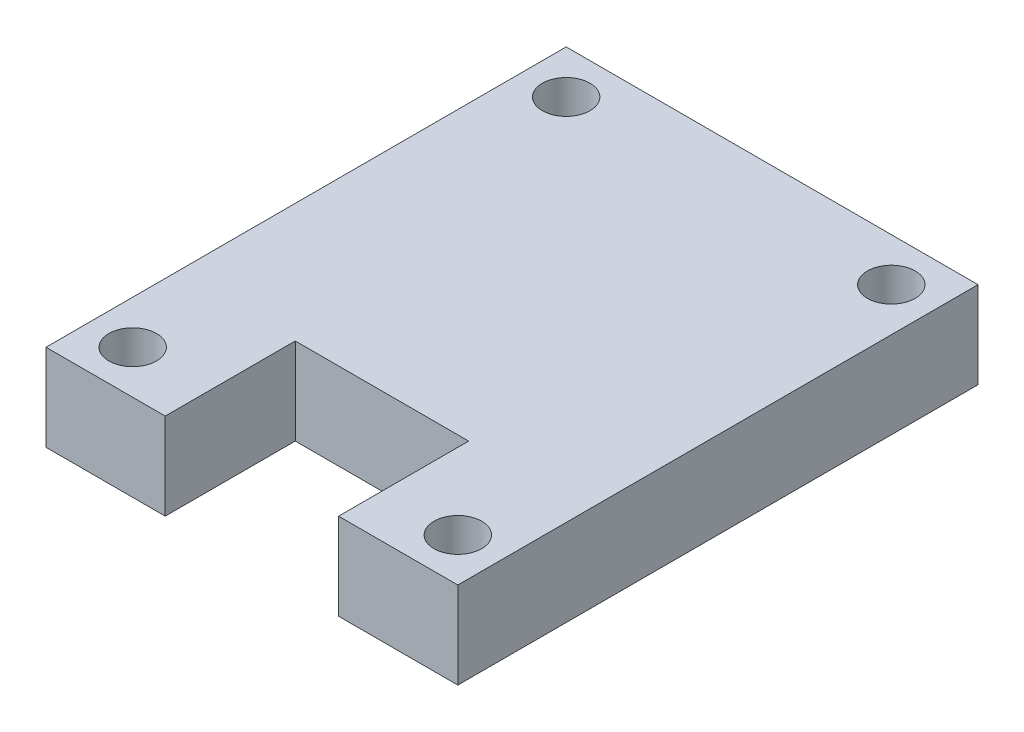
ISO-10303-21;
HEADER;
FILE_DESCRIPTION(('STEP AP214'),'2;1');
FILE_NAME('part.step','',(''),(''),'','','');
FILE_SCHEMA(('AUTOMOTIVE_DESIGN { 1 0 10303 214 1 1 1 1 }'));
ENDSEC;
DATA;
#1=APPLICATION_CONTEXT('core data for automotive mechanical design processes');
#2=APPLICATION_PROTOCOL_DEFINITION('international standard','automotive_design',2000,#1);
#3=PRODUCT_CONTEXT('',#1,'mechanical');
#4=PRODUCT('Part','Part','',(#3));
#5=PRODUCT_RELATED_PRODUCT_CATEGORY('part','',(#4));
#6=PRODUCT_DEFINITION_FORMATION('','',#4);
#7=PRODUCT_DEFINITION_CONTEXT('part definition',#1,'design');
#8=PRODUCT_DEFINITION('design','',#6,#7);
#9=PRODUCT_DEFINITION_SHAPE('','',#8);
#10=(LENGTH_UNIT() NAMED_UNIT(*) SI_UNIT(.MILLI.,.METRE.));
#11=(NAMED_UNIT(*) PLANE_ANGLE_UNIT() SI_UNIT($,.RADIAN.));
#12=(NAMED_UNIT(*) SI_UNIT($,.STERADIAN.) SOLID_ANGLE_UNIT());
#13=UNCERTAINTY_MEASURE_WITH_UNIT(LENGTH_MEASURE(1.E-05),#10,'distance_accuracy_value','');
#14=(GEOMETRIC_REPRESENTATION_CONTEXT(3) GLOBAL_UNCERTAINTY_ASSIGNED_CONTEXT((#13)) GLOBAL_UNIT_ASSIGNED_CONTEXT((#10,
#11,#12)) REPRESENTATION_CONTEXT('',''));
#15=CARTESIAN_POINT('',(0.,0.,0.));
#16=DIRECTION('',(0.,0.,1.));
#17=DIRECTION('',(1.,0.,0.));
#18=AXIS2_PLACEMENT_3D('',#15,#16,#17);
#19=CARTESIAN_POINT('',(0.,8.,0.));
#20=DIRECTION('',(0.,0.,-1.));
#21=DIRECTION('',(-1.,0.,0.));
#22=AXIS2_PLACEMENT_3D('',#19,#20,#21);
#23=PLANE('',#22);
#24=DIRECTION('',(1.,0.,0.));
#25=VECTOR('',#24,1.);
#26=CARTESIAN_POINT('',(0.,0.,0.));
#27=LINE('',#26,#25);
#28=CARTESIAN_POINT('',(0.,0.,0.));
#29=VERTEX_POINT('',#28);
#30=CARTESIAN_POINT('',(11.,0.,0.));
#31=VERTEX_POINT('',#30);
#32=EDGE_CURVE('E134',#29,#31,#27,.T.);
#33=ORIENTED_EDGE('',*,*,#32,.T.);
#34=DIRECTION('',(0.,1.,0.));
#35=VECTOR('',#34,1.);
#36=CARTESIAN_POINT('',(11.,0.,0.));
#37=LINE('',#36,#35);
#38=CARTESIAN_POINT('',(11.,8.,0.));
#39=VERTEX_POINT('',#38);
#40=EDGE_CURVE('E168',#31,#39,#37,.T.);
#41=ORIENTED_EDGE('',*,*,#40,.T.);
#42=DIRECTION('',(1.,0.,0.));
#43=VECTOR('',#42,1.);
#44=CARTESIAN_POINT('',(0.,8.,0.));
#45=LINE('',#44,#43);
#46=CARTESIAN_POINT('',(0.,8.,0.));
#47=VERTEX_POINT('',#46);
#48=EDGE_CURVE('E89',#47,#39,#45,.T.);
#49=ORIENTED_EDGE('',*,*,#48,.F.);
#50=DIRECTION('',(0.,-1.,0.));
#51=VECTOR('',#50,1.);
#52=CARTESIAN_POINT('',(0.,8.,0.));
#53=LINE('',#52,#51);
#54=EDGE_CURVE('E11',#47,#29,#53,.T.);
#55=ORIENTED_EDGE('',*,*,#54,.T.);
#56=EDGE_LOOP('',(#33,#41,#49,#55));
#57=FACE_BOUND('',#56,.T.);
#58=ADVANCED_FACE('F37',(#57),#23,.F.);
#59=CARTESIAN_POINT('',(0.,8.,-48.));
#60=DIRECTION('',(1.,0.,0.));
#61=DIRECTION('',(0.,0.,-1.));
#62=AXIS2_PLACEMENT_3D('',#59,#60,#61);
#63=PLANE('',#62);
#64=DIRECTION('',(0.,0.,1.));
#65=VECTOR('',#64,1.);
#66=CARTESIAN_POINT('',(0.,0.,-48.));
#67=LINE('',#66,#65);
#68=CARTESIAN_POINT('',(0.,0.,-48.));
#69=VERTEX_POINT('',#68);
#70=EDGE_CURVE('E135',#69,#29,#67,.T.);
#71=ORIENTED_EDGE('',*,*,#70,.T.);
#72=ORIENTED_EDGE('',*,*,#54,.F.);
#73=DIRECTION('',(0.,0.,1.));
#74=VECTOR('',#73,1.);
#75=CARTESIAN_POINT('',(0.,8.,-48.));
#76=LINE('',#75,#74);
#77=CARTESIAN_POINT('',(0.,8.,-48.));
#78=VERTEX_POINT('',#77);
#79=EDGE_CURVE('E145',#78,#47,#76,.T.);
#80=ORIENTED_EDGE('',*,*,#79,.F.);
#81=DIRECTION('',(0.,-1.,0.));
#82=VECTOR('',#81,1.);
#83=CARTESIAN_POINT('',(0.,8.,-48.));
#84=LINE('',#83,#82);
#85=EDGE_CURVE('E146',#78,#69,#84,.T.);
#86=ORIENTED_EDGE('',*,*,#85,.T.);
#87=EDGE_LOOP('',(#71,#72,#80,#86));
#88=FACE_BOUND('',#87,.T.);
#89=ADVANCED_FACE('F39',(#88),#63,.F.);
#90=CARTESIAN_POINT('',(27.,8.,0.));
#91=VERTEX_POINT('',#90);
#92=CARTESIAN_POINT('',(38.,8.,0.));
#93=VERTEX_POINT('',#92);
#94=EDGE_CURVE('E128',#91,#93,#45,.T.);
#95=ORIENTED_EDGE('',*,*,#94,.F.);
#96=DIRECTION('',(0.,1.,0.));
#97=VECTOR('',#96,1.);
#98=CARTESIAN_POINT('',(27.,0.,0.));
#99=LINE('',#98,#97);
#100=CARTESIAN_POINT('',(27.,0.,0.));
#101=VERTEX_POINT('',#100);
#102=EDGE_CURVE('E115',#101,#91,#99,.T.);
#103=ORIENTED_EDGE('',*,*,#102,.F.);
#104=CARTESIAN_POINT('',(38.,0.,0.));
#105=VERTEX_POINT('',#104);
#106=EDGE_CURVE('E126',#101,#105,#27,.T.);
#107=ORIENTED_EDGE('',*,*,#106,.T.);
#108=DIRECTION('',(0.,-1.,0.));
#109=VECTOR('',#108,1.);
#110=CARTESIAN_POINT('',(38.,8.,0.));
#111=LINE('',#110,#109);
#112=EDGE_CURVE('E45',#93,#105,#111,.T.);
#113=ORIENTED_EDGE('',*,*,#112,.F.);
#114=EDGE_LOOP('',(#95,#103,#107,#113));
#115=FACE_BOUND('',#114,.T.);
#116=ADVANCED_FACE('F124',(#115),#23,.F.);
#117=CARTESIAN_POINT('',(38.,8.,0.));
#118=DIRECTION('',(-1.,0.,0.));
#119=DIRECTION('',(0.,0.,1.));
#120=AXIS2_PLACEMENT_3D('',#117,#118,#119);
#121=PLANE('',#120);
#122=DIRECTION('',(0.,0.,-1.));
#123=VECTOR('',#122,1.);
#124=CARTESIAN_POINT('',(38.,0.,0.));
#125=LINE('',#124,#123);
#126=CARTESIAN_POINT('',(38.,0.,-48.));
#127=VERTEX_POINT('',#126);
#128=EDGE_CURVE('E133',#105,#127,#125,.T.);
#129=ORIENTED_EDGE('',*,*,#128,.T.);
#130=DIRECTION('',(0.,-1.,0.));
#131=VECTOR('',#130,1.);
#132=CARTESIAN_POINT('',(38.,8.,-48.));
#133=LINE('',#132,#131);
#134=CARTESIAN_POINT('',(38.,8.,-48.));
#135=VERTEX_POINT('',#134);
#136=EDGE_CURVE('E148',#135,#127,#133,.T.);
#137=ORIENTED_EDGE('',*,*,#136,.F.);
#138=DIRECTION('',(0.,0.,-1.));
#139=VECTOR('',#138,1.);
#140=CARTESIAN_POINT('',(38.,8.,0.));
#141=LINE('',#140,#139);
#142=EDGE_CURVE('E153',#93,#135,#141,.T.);
#143=ORIENTED_EDGE('',*,*,#142,.F.);
#144=ORIENTED_EDGE('',*,*,#112,.T.);
#145=EDGE_LOOP('',(#129,#137,#143,#144));
#146=FACE_BOUND('',#145,.T.);
#147=ADVANCED_FACE('F151',(#146),#121,.F.);
#148=CARTESIAN_POINT('',(38.,8.,-48.));
#149=DIRECTION('',(0.,0.,1.));
#150=DIRECTION('',(1.,0.,0.));
#151=AXIS2_PLACEMENT_3D('',#148,#149,#150);
#152=PLANE('',#151);
#153=DIRECTION('',(-1.,0.,0.));
#154=VECTOR('',#153,1.);
#155=CARTESIAN_POINT('',(38.,0.,-48.));
#156=LINE('',#155,#154);
#157=EDGE_CURVE('E82',#127,#69,#156,.T.);
#158=ORIENTED_EDGE('',*,*,#157,.T.);
#159=ORIENTED_EDGE('',*,*,#85,.F.);
#160=DIRECTION('',(-1.,0.,0.));
#161=VECTOR('',#160,1.);
#162=CARTESIAN_POINT('',(38.,8.,-48.));
#163=LINE('',#162,#161);
#164=EDGE_CURVE('E61',#135,#78,#163,.T.);
#165=ORIENTED_EDGE('',*,*,#164,.F.);
#166=ORIENTED_EDGE('',*,*,#136,.T.);
#167=EDGE_LOOP('',(#158,#159,#165,#166));
#168=FACE_BOUND('',#167,.T.);
#169=ADVANCED_FACE('F200',(#168),#152,.F.);
#170=CARTESIAN_POINT('',(0.,8.,0.));
#171=DIRECTION('',(0.,1.,0.));
#172=DIRECTION('',(0.,0.,1.));
#173=AXIS2_PLACEMENT_3D('',#170,#171,#172);
#174=PLANE('',#173);
#175=DIRECTION('',(0.,0.,1.));
#176=VECTOR('',#175,1.);
#177=CARTESIAN_POINT('',(11.,8.,0.));
#178=LINE('',#177,#176);
#179=CARTESIAN_POINT('',(11.,8.,-12.));
#180=VERTEX_POINT('',#179);
#181=EDGE_CURVE('E120',#180,#39,#178,.T.);
#182=ORIENTED_EDGE('',*,*,#181,.F.);
#183=DIRECTION('',(-1.,0.,0.));
#184=VECTOR('',#183,1.);
#185=CARTESIAN_POINT('',(11.,8.,-12.));
#186=LINE('',#185,#184);
#187=CARTESIAN_POINT('',(27.,8.,-12.));
#188=VERTEX_POINT('',#187);
#189=EDGE_CURVE('E187',#188,#180,#186,.T.);
#190=ORIENTED_EDGE('',*,*,#189,.F.);
#191=DIRECTION('',(0.,0.,-1.));
#192=VECTOR('',#191,1.);
#193=CARTESIAN_POINT('',(27.,8.,-12.));
#194=LINE('',#193,#192);
#195=EDGE_CURVE('E190',#91,#188,#194,.T.);
#196=ORIENTED_EDGE('',*,*,#195,.F.);
#197=ORIENTED_EDGE('',*,*,#94,.T.);
#198=ORIENTED_EDGE('',*,*,#142,.T.);
#199=ORIENTED_EDGE('',*,*,#164,.T.);
#200=ORIENTED_EDGE('',*,*,#79,.T.);
#201=ORIENTED_EDGE('',*,*,#48,.T.);
#202=EDGE_LOOP('',(#182,#190,#196,#197,#198,#199,#200,#201));
#203=FACE_BOUND('',#202,.T.);
#204=CARTESIAN_POINT('',(4.,8.,-44.));
#205=DIRECTION('',(0.,-1.,0.));
#206=DIRECTION('',(0.,0.,-1.));
#207=AXIS2_PLACEMENT_3D('',#204,#205,#206);
#208=CIRCLE('',#207,2.2);
#209=CARTESIAN_POINT('',(4.,8.,-46.2));
#210=VERTEX_POINT('',#209);
#211=EDGE_CURVE('E167',#210,#210,#208,.T.);
#212=ORIENTED_EDGE('',*,*,#211,.T.);
#213=EDGE_LOOP('',(#212));
#214=FACE_BOUND('',#213,.T.);
#215=CARTESIAN_POINT('',(34.,8.,-44.));
#216=DIRECTION('',(0.,-1.,0.));
#217=DIRECTION('',(0.,0.,-1.));
#218=AXIS2_PLACEMENT_3D('',#215,#216,#217);
#219=CIRCLE('',#218,2.2);
#220=CARTESIAN_POINT('',(34.,8.,-46.2));
#221=VERTEX_POINT('',#220);
#222=EDGE_CURVE('E174',#221,#221,#219,.T.);
#223=ORIENTED_EDGE('',*,*,#222,.T.);
#224=EDGE_LOOP('',(#223));
#225=FACE_BOUND('',#224,.T.);
#226=CARTESIAN_POINT('',(34.,8.,-4.));
#227=DIRECTION('',(0.,-1.,0.));
#228=DIRECTION('',(0.,0.,-1.));
#229=AXIS2_PLACEMENT_3D('',#226,#227,#228);
#230=CIRCLE('',#229,2.2);
#231=CARTESIAN_POINT('',(34.,8.,-6.2));
#232=VERTEX_POINT('',#231);
#233=EDGE_CURVE('E161',#232,#232,#230,.T.);
#234=ORIENTED_EDGE('',*,*,#233,.T.);
#235=EDGE_LOOP('',(#234));
#236=FACE_BOUND('',#235,.T.);
#237=CARTESIAN_POINT('',(4.,8.,-4.));
#238=DIRECTION('',(0.,-1.,0.));
#239=DIRECTION('',(0.,0.,-1.));
#240=AXIS2_PLACEMENT_3D('',#237,#238,#239);
#241=CIRCLE('',#240,2.2);
#242=CARTESIAN_POINT('',(4.,8.,-6.2));
#243=VERTEX_POINT('',#242);
#244=EDGE_CURVE('E139',#243,#243,#241,.T.);
#245=ORIENTED_EDGE('',*,*,#244,.T.);
#246=EDGE_LOOP('',(#245));
#247=FACE_BOUND('',#246,.T.);
#248=ADVANCED_FACE('F202',(#203,#214,#225,#236,#247),#174,.T.);
#249=CARTESIAN_POINT('',(0.,0.,0.));
#250=DIRECTION('',(0.,1.,0.));
#251=DIRECTION('',(0.,0.,1.));
#252=AXIS2_PLACEMENT_3D('',#249,#250,#251);
#253=PLANE('',#252);
#254=CARTESIAN_POINT('',(4.,0.,-44.));
#255=DIRECTION('',(0.,-1.,0.));
#256=DIRECTION('',(0.,0.,-1.));
#257=AXIS2_PLACEMENT_3D('',#254,#255,#256);
#258=CIRCLE('',#257,2.2);
#259=CARTESIAN_POINT('',(4.,0.,-46.2));
#260=VERTEX_POINT('',#259);
#261=EDGE_CURVE('E164',#260,#260,#258,.T.);
#262=ORIENTED_EDGE('',*,*,#261,.F.);
#263=EDGE_LOOP('',(#262));
#264=FACE_BOUND('',#263,.T.);
#265=CARTESIAN_POINT('',(34.,0.,-44.));
#266=DIRECTION('',(0.,-1.,0.));
#267=DIRECTION('',(0.,0.,-1.));
#268=AXIS2_PLACEMENT_3D('',#265,#266,#267);
#269=CIRCLE('',#268,2.2);
#270=CARTESIAN_POINT('',(34.,0.,-46.2));
#271=VERTEX_POINT('',#270);
#272=EDGE_CURVE('E171',#271,#271,#269,.T.);
#273=ORIENTED_EDGE('',*,*,#272,.F.);
#274=EDGE_LOOP('',(#273));
#275=FACE_BOUND('',#274,.T.);
#276=CARTESIAN_POINT('',(34.,0.,-4.));
#277=DIRECTION('',(0.,-1.,0.));
#278=DIRECTION('',(0.,0.,-1.));
#279=AXIS2_PLACEMENT_3D('',#276,#277,#278);
#280=CIRCLE('',#279,2.2);
#281=CARTESIAN_POINT('',(34.,0.,-6.2));
#282=VERTEX_POINT('',#281);
#283=EDGE_CURVE('E177',#282,#282,#280,.T.);
#284=ORIENTED_EDGE('',*,*,#283,.F.);
#285=EDGE_LOOP('',(#284));
#286=FACE_BOUND('',#285,.T.);
#287=CARTESIAN_POINT('',(4.,0.,-4.));
#288=DIRECTION('',(0.,-1.,0.));
#289=DIRECTION('',(0.,0.,-1.));
#290=AXIS2_PLACEMENT_3D('',#287,#288,#289);
#291=CIRCLE('',#290,2.2);
#292=CARTESIAN_POINT('',(4.,0.,-6.2));
#293=VERTEX_POINT('',#292);
#294=EDGE_CURVE('E158',#293,#293,#291,.T.);
#295=ORIENTED_EDGE('',*,*,#294,.F.);
#296=EDGE_LOOP('',(#295));
#297=FACE_BOUND('',#296,.T.);
#298=DIRECTION('',(-1.,0.,0.));
#299=VECTOR('',#298,1.);
#300=CARTESIAN_POINT('',(19.,0.,-12.));
#301=LINE('',#300,#299);
#302=CARTESIAN_POINT('',(27.,0.,-12.));
#303=VERTEX_POINT('',#302);
#304=CARTESIAN_POINT('',(11.,0.,-12.));
#305=VERTEX_POINT('',#304);
#306=EDGE_CURVE('E52',#303,#305,#301,.T.);
#307=ORIENTED_EDGE('',*,*,#306,.T.);
#308=DIRECTION('',(0.,0.,1.));
#309=VECTOR('',#308,1.);
#310=CARTESIAN_POINT('',(11.,0.,0.));
#311=LINE('',#310,#309);
#312=EDGE_CURVE('E129',#305,#31,#311,.T.);
#313=ORIENTED_EDGE('',*,*,#312,.T.);
#314=ORIENTED_EDGE('',*,*,#32,.F.);
#315=ORIENTED_EDGE('',*,*,#70,.F.);
#316=ORIENTED_EDGE('',*,*,#157,.F.);
#317=ORIENTED_EDGE('',*,*,#128,.F.);
#318=ORIENTED_EDGE('',*,*,#106,.F.);
#319=DIRECTION('',(0.,0.,-1.));
#320=VECTOR('',#319,1.);
#321=CARTESIAN_POINT('',(27.,0.,-12.));
#322=LINE('',#321,#320);
#323=EDGE_CURVE('E111',#101,#303,#322,.T.);
#324=ORIENTED_EDGE('',*,*,#323,.T.);
#325=EDGE_LOOP('',(#307,#313,#314,#315,#316,#317,#318,#324));
#326=FACE_BOUND('',#325,.T.);
#327=ADVANCED_FACE('F132',(#264,#275,#286,#297,#326),#253,.F.);
#328=CARTESIAN_POINT('',(4.,8.,-4.));
#329=DIRECTION('',(0.,-1.,0.));
#330=DIRECTION('',(0.,0.,-1.));
#331=AXIS2_PLACEMENT_3D('',#328,#329,#330);
#332=CYLINDRICAL_SURFACE('',#331,2.2);
#333=ORIENTED_EDGE('',*,*,#244,.F.);
#334=EDGE_LOOP('',(#333));
#335=FACE_BOUND('',#334,.T.);
#336=ORIENTED_EDGE('',*,*,#294,.T.);
#337=EDGE_LOOP('',(#336));
#338=FACE_BOUND('',#337,.T.);
#339=ADVANCED_FACE('F237',(#335,#338),#332,.F.);
#340=CARTESIAN_POINT('',(34.,8.,-4.));
#341=DIRECTION('',(0.,-1.,0.));
#342=DIRECTION('',(0.,0.,-1.));
#343=AXIS2_PLACEMENT_3D('',#340,#341,#342);
#344=CYLINDRICAL_SURFACE('',#343,2.2);
#345=ORIENTED_EDGE('',*,*,#233,.F.);
#346=EDGE_LOOP('',(#345));
#347=FACE_BOUND('',#346,.T.);
#348=ORIENTED_EDGE('',*,*,#283,.T.);
#349=EDGE_LOOP('',(#348));
#350=FACE_BOUND('',#349,.T.);
#351=ADVANCED_FACE('F242',(#347,#350),#344,.F.);
#352=CARTESIAN_POINT('',(34.,8.,-44.));
#353=DIRECTION('',(0.,-1.,0.));
#354=DIRECTION('',(0.,0.,-1.));
#355=AXIS2_PLACEMENT_3D('',#352,#353,#354);
#356=CYLINDRICAL_SURFACE('',#355,2.2);
#357=ORIENTED_EDGE('',*,*,#222,.F.);
#358=EDGE_LOOP('',(#357));
#359=FACE_BOUND('',#358,.T.);
#360=ORIENTED_EDGE('',*,*,#272,.T.);
#361=EDGE_LOOP('',(#360));
#362=FACE_BOUND('',#361,.T.);
#363=ADVANCED_FACE('F254',(#359,#362),#356,.F.);
#364=CARTESIAN_POINT('',(4.,8.,-44.));
#365=DIRECTION('',(0.,-1.,0.));
#366=DIRECTION('',(0.,0.,-1.));
#367=AXIS2_PLACEMENT_3D('',#364,#365,#366);
#368=CYLINDRICAL_SURFACE('',#367,2.2);
#369=ORIENTED_EDGE('',*,*,#211,.F.);
#370=EDGE_LOOP('',(#369));
#371=FACE_BOUND('',#370,.T.);
#372=ORIENTED_EDGE('',*,*,#261,.T.);
#373=EDGE_LOOP('',(#372));
#374=FACE_BOUND('',#373,.T.);
#375=ADVANCED_FACE('F264',(#371,#374),#368,.F.);
#376=CARTESIAN_POINT('',(11.,0.,0.));
#377=DIRECTION('',(-1.,0.,0.));
#378=DIRECTION('',(0.,0.,1.));
#379=AXIS2_PLACEMENT_3D('',#376,#377,#378);
#380=PLANE('',#379);
#381=ORIENTED_EDGE('',*,*,#181,.T.);
#382=ORIENTED_EDGE('',*,*,#40,.F.);
#383=ORIENTED_EDGE('',*,*,#312,.F.);
#384=DIRECTION('',(0.,1.,0.));
#385=VECTOR('',#384,1.);
#386=CARTESIAN_POINT('',(11.,0.,-12.));
#387=LINE('',#386,#385);
#388=EDGE_CURVE('E183',#305,#180,#387,.T.);
#389=ORIENTED_EDGE('',*,*,#388,.T.);
#390=EDGE_LOOP('',(#381,#382,#383,#389));
#391=FACE_BOUND('',#390,.T.);
#392=ADVANCED_FACE('F273',(#391),#380,.F.);
#393=CARTESIAN_POINT('',(11.,0.,-12.));
#394=DIRECTION('',(0.,0.,-1.));
#395=DIRECTION('',(-1.,0.,0.));
#396=AXIS2_PLACEMENT_3D('',#393,#394,#395);
#397=PLANE('',#396);
#398=ORIENTED_EDGE('',*,*,#189,.T.);
#399=ORIENTED_EDGE('',*,*,#388,.F.);
#400=ORIENTED_EDGE('',*,*,#306,.F.);
#401=DIRECTION('',(0.,1.,0.));
#402=VECTOR('',#401,1.);
#403=CARTESIAN_POINT('',(27.,0.,-12.));
#404=LINE('',#403,#402);
#405=EDGE_CURVE('E117',#303,#188,#404,.T.);
#406=ORIENTED_EDGE('',*,*,#405,.T.);
#407=EDGE_LOOP('',(#398,#399,#400,#406));
#408=FACE_BOUND('',#407,.T.);
#409=ADVANCED_FACE('F289',(#408),#397,.F.);
#410=CARTESIAN_POINT('',(27.,0.,-12.));
#411=DIRECTION('',(1.,0.,0.));
#412=DIRECTION('',(0.,0.,-1.));
#413=AXIS2_PLACEMENT_3D('',#410,#411,#412);
#414=PLANE('',#413);
#415=ORIENTED_EDGE('',*,*,#195,.T.);
#416=ORIENTED_EDGE('',*,*,#405,.F.);
#417=ORIENTED_EDGE('',*,*,#323,.F.);
#418=ORIENTED_EDGE('',*,*,#102,.T.);
#419=EDGE_LOOP('',(#415,#416,#417,#418));
#420=FACE_BOUND('',#419,.T.);
#421=ADVANCED_FACE('F114',(#420),#414,.F.);
#422=CLOSED_SHELL('',(#58,#89,#116,#147,#169,#248,#327,#339,#351,#363,#375,#392,#409,#421));
#423=MANIFOLD_SOLID_BREP('B2',#422);
#424=ADVANCED_BREP_SHAPE_REPRESENTATION('',(#18,#423),#14);
#425=SHAPE_DEFINITION_REPRESENTATION(#9,#424);
ENDSEC;
END-ISO-10303-21;
